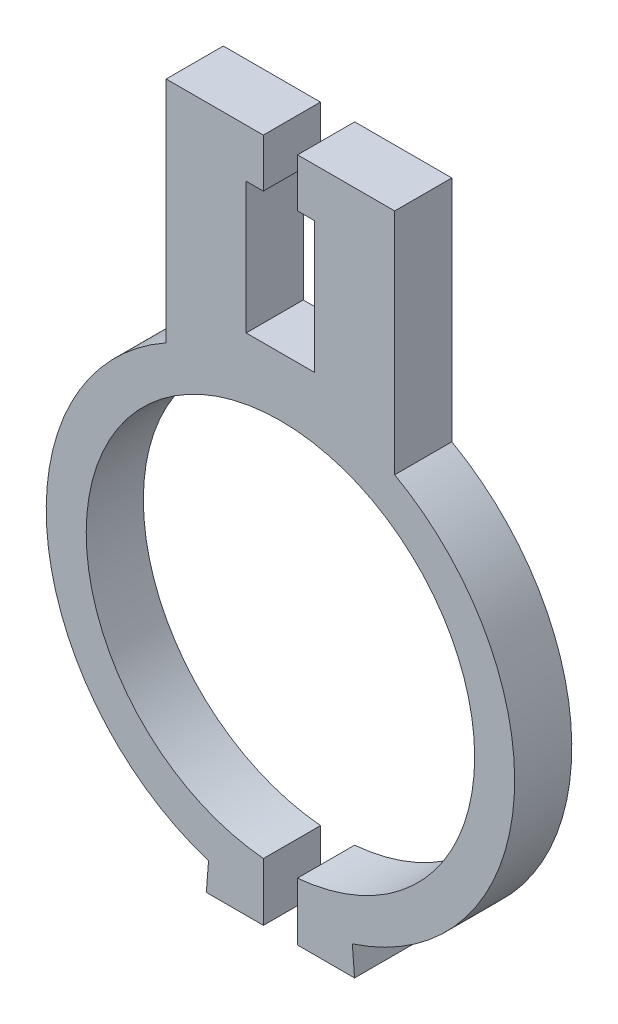
ISO-10303-21;
HEADER;
FILE_DESCRIPTION(('STEP AP214'),'2;1');
FILE_NAME('part.step','',(''),(''),'','','');
FILE_SCHEMA(('AUTOMOTIVE_DESIGN { 1 0 10303 214 1 1 1 1 }'));
ENDSEC;
DATA;
#1=APPLICATION_CONTEXT('core data for automotive mechanical design processes');
#2=APPLICATION_PROTOCOL_DEFINITION('international standard','automotive_design',2000,#1);
#3=PRODUCT_CONTEXT('',#1,'mechanical');
#4=PRODUCT('Part','Part','',(#3));
#5=PRODUCT_RELATED_PRODUCT_CATEGORY('part','',(#4));
#6=PRODUCT_DEFINITION_FORMATION('','',#4);
#7=PRODUCT_DEFINITION_CONTEXT('part definition',#1,'design');
#8=PRODUCT_DEFINITION('design','',#6,#7);
#9=PRODUCT_DEFINITION_SHAPE('','',#8);
#10=(LENGTH_UNIT() NAMED_UNIT(*) SI_UNIT(.MILLI.,.METRE.));
#11=(NAMED_UNIT(*) PLANE_ANGLE_UNIT() SI_UNIT($,.RADIAN.));
#12=(NAMED_UNIT(*) SI_UNIT($,.STERADIAN.) SOLID_ANGLE_UNIT());
#13=UNCERTAINTY_MEASURE_WITH_UNIT(LENGTH_MEASURE(1.E-05),#10,'distance_accuracy_value','');
#14=(GEOMETRIC_REPRESENTATION_CONTEXT(3) GLOBAL_UNCERTAINTY_ASSIGNED_CONTEXT((#13)) GLOBAL_UNIT_ASSIGNED_CONTEXT((#10,
#11,#12)) REPRESENTATION_CONTEXT('',''));
#15=CARTESIAN_POINT('',(0.,0.,0.));
#16=DIRECTION('',(0.,0.,1.));
#17=DIRECTION('',(1.,0.,0.));
#18=AXIS2_PLACEMENT_3D('',#15,#16,#17);
#19=CARTESIAN_POINT('',(0.,0.,10.));
#20=DIRECTION('',(0.,0.,-1.));
#21=DIRECTION('',(-1.,0.,0.));
#22=AXIS2_PLACEMENT_3D('',#19,#20,#21);
#23=CYLINDRICAL_SURFACE('',#22,41.);
#24=CARTESIAN_POINT('',(0.,0.,0.));
#25=DIRECTION('',(0.,0.,1.));
#26=DIRECTION('',(1.,0.,0.));
#27=AXIS2_PLACEMENT_3D('',#24,#25,#26);
#28=CIRCLE('',#27,41.);
#29=CARTESIAN_POINT('',(-20.,35.7910603363466,0.));
#30=VERTEX_POINT('',#29);
#31=CARTESIAN_POINT('',(-12.5812848529524,-39.0219332100406,0.));
#32=VERTEX_POINT('',#31);
#33=EDGE_CURVE('E212',#30,#32,#28,.T.);
#34=ORIENTED_EDGE('',*,*,#33,.T.);
#35=DIRECTION('',(0.,0.,-1.));
#36=VECTOR('',#35,1.);
#37=CARTESIAN_POINT('',(-12.5812848529524,-39.0219332100406,10.));
#38=LINE('',#37,#36);
#39=CARTESIAN_POINT('',(-12.5812848529524,-39.0219332100406,10.));
#40=VERTEX_POINT('',#39);
#41=EDGE_CURVE('E11',#40,#32,#38,.T.);
#42=ORIENTED_EDGE('',*,*,#41,.F.);
#43=CARTESIAN_POINT('',(0.,0.,10.));
#44=DIRECTION('',(0.,0.,1.));
#45=DIRECTION('',(1.,0.,0.));
#46=AXIS2_PLACEMENT_3D('',#43,#44,#45);
#47=CIRCLE('',#46,41.);
#48=CARTESIAN_POINT('',(-20.,35.7910603363466,10.));
#49=VERTEX_POINT('',#48);
#50=EDGE_CURVE('E273',#49,#40,#47,.T.);
#51=ORIENTED_EDGE('',*,*,#50,.F.);
#52=DIRECTION('',(0.,0.,-1.));
#53=VECTOR('',#52,1.);
#54=CARTESIAN_POINT('',(-20.,35.7910603363466,10.));
#55=LINE('',#54,#53);
#56=EDGE_CURVE('E208',#49,#30,#55,.T.);
#57=ORIENTED_EDGE('',*,*,#56,.T.);
#58=EDGE_LOOP('',(#34,#42,#51,#57));
#59=FACE_BOUND('',#58,.T.);
#60=ADVANCED_FACE('F39',(#59),#23,.T.);
#61=CARTESIAN_POINT('',(-12.5812848529524,-39.0219332100406,10.));
#62=DIRECTION('',(0.9968944455987,-0.0787493767242696,0.));
#63=DIRECTION('',(0.0787493767242696,0.9968944455987,0.));
#64=AXIS2_PLACEMENT_3D('',#61,#62,#63);
#65=PLANE('',#64);
#66=DIRECTION('',(-0.0787493767242696,-0.9968944455987,0.));
#67=VECTOR('',#66,1.);
#68=CARTESIAN_POINT('',(-12.5812848529524,-39.0219332100406,0.));
#69=LINE('',#68,#67);
#70=CARTESIAN_POINT('',(-12.9750317365737,-44.0064054380341,0.));
#71=VERTEX_POINT('',#70);
#72=EDGE_CURVE('E216',#32,#71,#69,.T.);
#73=ORIENTED_EDGE('',*,*,#72,.T.);
#74=DIRECTION('',(0.,0.,-1.));
#75=VECTOR('',#74,1.);
#76=CARTESIAN_POINT('',(-12.9750317365737,-44.0064054380341,10.));
#77=LINE('',#76,#75);
#78=CARTESIAN_POINT('',(-12.9750317365737,-44.0064054380341,10.));
#79=VERTEX_POINT('',#78);
#80=EDGE_CURVE('E48',#79,#71,#77,.T.);
#81=ORIENTED_EDGE('',*,*,#80,.F.);
#82=DIRECTION('',(-0.0787493767242696,-0.9968944455987,0.));
#83=VECTOR('',#82,1.);
#84=CARTESIAN_POINT('',(-12.5812848529524,-39.0219332100406,10.));
#85=LINE('',#84,#83);
#86=EDGE_CURVE('E135',#40,#79,#85,.T.);
#87=ORIENTED_EDGE('',*,*,#86,.F.);
#88=ORIENTED_EDGE('',*,*,#41,.T.);
#89=EDGE_LOOP('',(#73,#81,#87,#88));
#90=FACE_BOUND('',#89,.T.);
#91=ADVANCED_FACE('F421',(#90),#65,.F.);
#92=CARTESIAN_POINT('',(-12.9750317365737,-44.0064054380341,10.));
#93=DIRECTION('',(0.,1.,0.));
#94=DIRECTION('',(0.,0.,1.));
#95=AXIS2_PLACEMENT_3D('',#92,#93,#94);
#96=PLANE('',#95);
#97=DIRECTION('',(1.,0.,0.));
#98=VECTOR('',#97,1.);
#99=CARTESIAN_POINT('',(-12.9750317365737,-44.0064054380341,0.));
#100=LINE('',#99,#98);
#101=CARTESIAN_POINT('',(-2.97503173657374,-44.0064054380341,0.));
#102=VERTEX_POINT('',#101);
#103=EDGE_CURVE('E219',#71,#102,#100,.T.);
#104=ORIENTED_EDGE('',*,*,#103,.T.);
#105=DIRECTION('',(0.,0.,-1.));
#106=VECTOR('',#105,1.);
#107=CARTESIAN_POINT('',(-2.97503173657374,-44.0064054380341,10.));
#108=LINE('',#107,#106);
#109=CARTESIAN_POINT('',(-2.97503173657374,-44.0064054380341,10.));
#110=VERTEX_POINT('',#109);
#111=EDGE_CURVE('E332',#110,#102,#108,.T.);
#112=ORIENTED_EDGE('',*,*,#111,.F.);
#113=DIRECTION('',(1.,0.,0.));
#114=VECTOR('',#113,1.);
#115=CARTESIAN_POINT('',(-12.9750317365737,-44.0064054380341,10.));
#116=LINE('',#115,#114);
#117=EDGE_CURVE('E342',#79,#110,#116,.T.);
#118=ORIENTED_EDGE('',*,*,#117,.F.);
#119=ORIENTED_EDGE('',*,*,#80,.T.);
#120=EDGE_LOOP('',(#104,#112,#118,#119));
#121=FACE_BOUND('',#120,.T.);
#122=ADVANCED_FACE('F340',(#121),#96,.F.);
#123=CARTESIAN_POINT('',(-2.97503173657374,-40.8919207933105,10.));
#124=DIRECTION('',(-1.,0.,0.));
#125=DIRECTION('',(0.,0.,1.));
#126=AXIS2_PLACEMENT_3D('',#123,#124,#125);
#127=PLANE('',#126);
#128=DIRECTION('',(0.,1.,0.));
#129=VECTOR('',#128,1.);
#130=CARTESIAN_POINT('',(-2.97503173657374,-40.8919207933105,0.));
#131=LINE('',#130,#129);
#132=CARTESIAN_POINT('',(-2.97503173657374,-33.8695908768674,0.));
#133=VERTEX_POINT('',#132);
#134=EDGE_CURVE('E223',#102,#133,#131,.T.);
#135=ORIENTED_EDGE('',*,*,#134,.T.);
#136=DIRECTION('',(0.,0.,-1.));
#137=VECTOR('',#136,1.);
#138=CARTESIAN_POINT('',(-2.97503173657374,-33.8695908768674,10.));
#139=LINE('',#138,#137);
#140=CARTESIAN_POINT('',(-2.97503173657374,-33.8695908768674,10.));
#141=VERTEX_POINT('',#140);
#142=EDGE_CURVE('E328',#141,#133,#139,.T.);
#143=ORIENTED_EDGE('',*,*,#142,.F.);
#144=DIRECTION('',(0.,1.,0.));
#145=VECTOR('',#144,1.);
#146=CARTESIAN_POINT('',(-2.97503173657374,-44.0064054380341,10.));
#147=LINE('',#146,#145);
#148=EDGE_CURVE('E359',#110,#141,#147,.T.);
#149=ORIENTED_EDGE('',*,*,#148,.F.);
#150=ORIENTED_EDGE('',*,*,#111,.T.);
#151=EDGE_LOOP('',(#135,#143,#149,#150));
#152=FACE_BOUND('',#151,.T.);
#153=ADVANCED_FACE('F349',(#152),#127,.F.);
#154=CARTESIAN_POINT('',(0.,0.,10.));
#155=DIRECTION('',(0.,0.,-1.));
#156=DIRECTION('',(-1.,0.,0.));
#157=AXIS2_PLACEMENT_3D('',#154,#155,#156);
#158=CYLINDRICAL_SURFACE('',#157,34.);
#159=CARTESIAN_POINT('',(0.,0.,0.));
#160=DIRECTION('',(0.,0.,-1.));
#161=DIRECTION('',(1.,0.,0.));
#162=AXIS2_PLACEMENT_3D('',#159,#160,#161);
#163=CIRCLE('',#162,34.);
#164=CARTESIAN_POINT('',(2.97503173657371,-33.8695908768674,0.));
#165=VERTEX_POINT('',#164);
#166=EDGE_CURVE('E226',#133,#165,#163,.T.);
#167=ORIENTED_EDGE('',*,*,#166,.T.);
#168=DIRECTION('',(0.,0.,-1.));
#169=VECTOR('',#168,1.);
#170=CARTESIAN_POINT('',(2.97503173657371,-33.8695908768674,10.));
#171=LINE('',#170,#169);
#172=CARTESIAN_POINT('',(2.97503173657371,-33.8695908768674,10.));
#173=VERTEX_POINT('',#172);
#174=EDGE_CURVE('E324',#173,#165,#171,.T.);
#175=ORIENTED_EDGE('',*,*,#174,.F.);
#176=CARTESIAN_POINT('',(0.,0.,10.));
#177=DIRECTION('',(0.,0.,-1.));
#178=DIRECTION('',(1.,0.,0.));
#179=AXIS2_PLACEMENT_3D('',#176,#177,#178);
#180=CIRCLE('',#179,34.);
#181=EDGE_CURVE('E355',#141,#173,#180,.T.);
#182=ORIENTED_EDGE('',*,*,#181,.F.);
#183=ORIENTED_EDGE('',*,*,#142,.T.);
#184=EDGE_LOOP('',(#167,#175,#182,#183));
#185=FACE_BOUND('',#184,.T.);
#186=ADVANCED_FACE('F353',(#185),#158,.F.);
#187=CARTESIAN_POINT('',(2.97503173657374,-44.0064054380341,10.));
#188=DIRECTION('',(1.,0.,0.));
#189=DIRECTION('',(0.,0.,-1.));
#190=AXIS2_PLACEMENT_3D('',#187,#188,#189);
#191=PLANE('',#190);
#192=DIRECTION('',(0.,-1.,0.));
#193=VECTOR('',#192,1.);
#194=CARTESIAN_POINT('',(2.97503173657374,-44.0064054380341,0.));
#195=LINE('',#194,#193);
#196=CARTESIAN_POINT('',(2.97503173657374,-44.0064054380341,0.));
#197=VERTEX_POINT('',#196);
#198=EDGE_CURVE('E230',#165,#197,#195,.T.);
#199=ORIENTED_EDGE('',*,*,#198,.T.);
#200=DIRECTION('',(0.,0.,-1.));
#201=VECTOR('',#200,1.);
#202=CARTESIAN_POINT('',(2.97503173657374,-44.0064054380341,10.));
#203=LINE('',#202,#201);
#204=CARTESIAN_POINT('',(2.97503173657374,-44.0064054380341,10.));
#205=VERTEX_POINT('',#204);
#206=EDGE_CURVE('E320',#205,#197,#203,.T.);
#207=ORIENTED_EDGE('',*,*,#206,.F.);
#208=DIRECTION('',(0.,-1.,0.));
#209=VECTOR('',#208,1.);
#210=CARTESIAN_POINT('',(2.97503173657374,-40.8919207933105,10.));
#211=LINE('',#210,#209);
#212=EDGE_CURVE('E358',#173,#205,#211,.T.);
#213=ORIENTED_EDGE('',*,*,#212,.F.);
#214=ORIENTED_EDGE('',*,*,#174,.T.);
#215=EDGE_LOOP('',(#199,#207,#213,#214));
#216=FACE_BOUND('',#215,.T.);
#217=ADVANCED_FACE('F434',(#216),#191,.F.);
#218=CARTESIAN_POINT('',(12.9750317365737,-44.0064054380341,10.));
#219=DIRECTION('',(0.,1.,0.));
#220=DIRECTION('',(0.,0.,1.));
#221=AXIS2_PLACEMENT_3D('',#218,#219,#220);
#222=PLANE('',#221);
#223=DIRECTION('',(1.,0.,0.));
#224=VECTOR('',#223,1.);
#225=CARTESIAN_POINT('',(12.9750317365737,-44.0064054380341,0.));
#226=LINE('',#225,#224);
#227=CARTESIAN_POINT('',(12.9750317365737,-44.0064054380341,0.));
#228=VERTEX_POINT('',#227);
#229=EDGE_CURVE('E233',#197,#228,#226,.T.);
#230=ORIENTED_EDGE('',*,*,#229,.T.);
#231=DIRECTION('',(0.,0.,-1.));
#232=VECTOR('',#231,1.);
#233=CARTESIAN_POINT('',(12.9750317365737,-44.0064054380341,10.));
#234=LINE('',#233,#232);
#235=CARTESIAN_POINT('',(12.9750317365737,-44.0064054380341,10.));
#236=VERTEX_POINT('',#235);
#237=EDGE_CURVE('E316',#236,#228,#234,.T.);
#238=ORIENTED_EDGE('',*,*,#237,.F.);
#239=DIRECTION('',(1.,0.,0.));
#240=VECTOR('',#239,1.);
#241=CARTESIAN_POINT('',(12.9750317365737,-44.0064054380341,10.));
#242=LINE('',#241,#240);
#243=EDGE_CURVE('E363',#205,#236,#242,.T.);
#244=ORIENTED_EDGE('',*,*,#243,.F.);
#245=ORIENTED_EDGE('',*,*,#206,.T.);
#246=EDGE_LOOP('',(#230,#238,#244,#245));
#247=FACE_BOUND('',#246,.T.);
#248=ADVANCED_FACE('F437',(#247),#222,.F.);
#249=CARTESIAN_POINT('',(12.5812848529524,-39.0219332100406,10.));
#250=DIRECTION('',(-0.9968944455987,-0.0787493767242696,0.));
#251=DIRECTION('',(0.0787493767242696,-0.9968944455987,0.));
#252=AXIS2_PLACEMENT_3D('',#249,#250,#251);
#253=PLANE('',#252);
#254=DIRECTION('',(-0.0787493767242696,0.9968944455987,0.));
#255=VECTOR('',#254,1.);
#256=CARTESIAN_POINT('',(12.5812848529524,-39.0219332100406,0.));
#257=LINE('',#256,#255);
#258=CARTESIAN_POINT('',(12.5812848529524,-39.0219332100406,0.));
#259=VERTEX_POINT('',#258);
#260=EDGE_CURVE('E236',#228,#259,#257,.T.);
#261=ORIENTED_EDGE('',*,*,#260,.T.);
#262=DIRECTION('',(0.,0.,-1.));
#263=VECTOR('',#262,1.);
#264=CARTESIAN_POINT('',(12.5812848529524,-39.0219332100406,10.));
#265=LINE('',#264,#263);
#266=CARTESIAN_POINT('',(12.5812848529524,-39.0219332100406,10.));
#267=VERTEX_POINT('',#266);
#268=EDGE_CURVE('E312',#267,#259,#265,.T.);
#269=ORIENTED_EDGE('',*,*,#268,.F.);
#270=DIRECTION('',(-0.0787493767242696,0.9968944455987,0.));
#271=VECTOR('',#270,1.);
#272=CARTESIAN_POINT('',(12.5812848529524,-39.0219332100406,10.));
#273=LINE('',#272,#271);
#274=EDGE_CURVE('E370',#236,#267,#273,.T.);
#275=ORIENTED_EDGE('',*,*,#274,.F.);
#276=ORIENTED_EDGE('',*,*,#237,.T.);
#277=EDGE_LOOP('',(#261,#269,#275,#276));
#278=FACE_BOUND('',#277,.T.);
#279=ADVANCED_FACE('F441',(#278),#253,.F.);
#280=CARTESIAN_POINT('',(0.,0.,10.));
#281=DIRECTION('',(0.,0.,-1.));
#282=DIRECTION('',(-1.,0.,0.));
#283=AXIS2_PLACEMENT_3D('',#280,#281,#282);
#284=CYLINDRICAL_SURFACE('',#283,41.);
#285=CARTESIAN_POINT('',(0.,0.,0.));
#286=DIRECTION('',(0.,0.,1.));
#287=DIRECTION('',(1.,0.,0.));
#288=AXIS2_PLACEMENT_3D('',#285,#286,#287);
#289=CIRCLE('',#288,41.);
#290=CARTESIAN_POINT('',(20.,35.7910603363466,0.));
#291=VERTEX_POINT('',#290);
#292=EDGE_CURVE('E239',#259,#291,#289,.T.);
#293=ORIENTED_EDGE('',*,*,#292,.T.);
#294=DIRECTION('',(0.,0.,-1.));
#295=VECTOR('',#294,1.);
#296=CARTESIAN_POINT('',(20.,35.7910603363466,10.));
#297=LINE('',#296,#295);
#298=CARTESIAN_POINT('',(20.,35.7910603363466,10.));
#299=VERTEX_POINT('',#298);
#300=EDGE_CURVE('E308',#299,#291,#297,.T.);
#301=ORIENTED_EDGE('',*,*,#300,.F.);
#302=CARTESIAN_POINT('',(0.,0.,10.));
#303=DIRECTION('',(0.,0.,1.));
#304=DIRECTION('',(1.,0.,0.));
#305=AXIS2_PLACEMENT_3D('',#302,#303,#304);
#306=CIRCLE('',#305,41.);
#307=EDGE_CURVE('E373',#267,#299,#306,.T.);
#308=ORIENTED_EDGE('',*,*,#307,.F.);
#309=ORIENTED_EDGE('',*,*,#268,.T.);
#310=EDGE_LOOP('',(#293,#301,#308,#309));
#311=FACE_BOUND('',#310,.T.);
#312=ADVANCED_FACE('F445',(#311),#284,.T.);
#313=CARTESIAN_POINT('',(20.,35.7910603363466,10.));
#314=DIRECTION('',(-1.,0.,0.));
#315=DIRECTION('',(0.,0.,1.));
#316=AXIS2_PLACEMENT_3D('',#313,#314,#315);
#317=PLANE('',#316);
#318=DIRECTION('',(0.,1.,0.));
#319=VECTOR('',#318,1.);
#320=CARTESIAN_POINT('',(20.,35.7910603363466,0.));
#321=LINE('',#320,#319);
#322=CARTESIAN_POINT('',(20.,75.7910603363466,0.));
#323=VERTEX_POINT('',#322);
#324=EDGE_CURVE('E242',#291,#323,#321,.T.);
#325=ORIENTED_EDGE('',*,*,#324,.T.);
#326=DIRECTION('',(0.,0.,-1.));
#327=VECTOR('',#326,1.);
#328=CARTESIAN_POINT('',(20.,75.7910603363466,10.));
#329=LINE('',#328,#327);
#330=CARTESIAN_POINT('',(20.,75.7910603363466,10.));
#331=VERTEX_POINT('',#330);
#332=EDGE_CURVE('E304',#331,#323,#329,.T.);
#333=ORIENTED_EDGE('',*,*,#332,.F.);
#334=DIRECTION('',(0.,1.,0.));
#335=VECTOR('',#334,1.);
#336=CARTESIAN_POINT('',(20.,35.7910603363466,10.));
#337=LINE('',#336,#335);
#338=EDGE_CURVE('E376',#299,#331,#337,.T.);
#339=ORIENTED_EDGE('',*,*,#338,.F.);
#340=ORIENTED_EDGE('',*,*,#300,.T.);
#341=EDGE_LOOP('',(#325,#333,#339,#340));
#342=FACE_BOUND('',#341,.T.);
#343=ADVANCED_FACE('F449',(#342),#317,.F.);
#344=CARTESIAN_POINT('',(20.,75.7910603363466,10.));
#345=DIRECTION('',(0.,-1.,0.));
#346=DIRECTION('',(0.,0.,-1.));
#347=AXIS2_PLACEMENT_3D('',#344,#345,#346);
#348=PLANE('',#347);
#349=DIRECTION('',(-1.,0.,0.));
#350=VECTOR('',#349,1.);
#351=CARTESIAN_POINT('',(20.,75.7910603363466,0.));
#352=LINE('',#351,#350);
#353=CARTESIAN_POINT('',(3.,75.7910603363466,0.));
#354=VERTEX_POINT('',#353);
#355=EDGE_CURVE('E245',#323,#354,#352,.T.);
#356=ORIENTED_EDGE('',*,*,#355,.T.);
#357=DIRECTION('',(0.,0.,-1.));
#358=VECTOR('',#357,1.);
#359=CARTESIAN_POINT('',(3.,75.7910603363466,10.));
#360=LINE('',#359,#358);
#361=CARTESIAN_POINT('',(3.,75.7910603363466,10.));
#362=VERTEX_POINT('',#361);
#363=EDGE_CURVE('E300',#362,#354,#360,.T.);
#364=ORIENTED_EDGE('',*,*,#363,.F.);
#365=DIRECTION('',(-1.,0.,0.));
#366=VECTOR('',#365,1.);
#367=CARTESIAN_POINT('',(20.,75.7910603363466,10.));
#368=LINE('',#367,#366);
#369=EDGE_CURVE('E379',#331,#362,#368,.T.);
#370=ORIENTED_EDGE('',*,*,#369,.F.);
#371=ORIENTED_EDGE('',*,*,#332,.T.);
#372=EDGE_LOOP('',(#356,#364,#370,#371));
#373=FACE_BOUND('',#372,.T.);
#374=ADVANCED_FACE('F453',(#373),#348,.F.);
#375=CARTESIAN_POINT('',(3.,75.7910603363466,10.));
#376=DIRECTION('',(1.,0.,0.));
#377=DIRECTION('',(0.,1.,0.));
#378=AXIS2_PLACEMENT_3D('',#375,#376,#377);
#379=PLANE('',#378);
#380=DIRECTION('',(0.,-1.,0.));
#381=VECTOR('',#380,1.);
#382=CARTESIAN_POINT('',(3.,75.7910603363466,0.));
#383=LINE('',#382,#381);
#384=CARTESIAN_POINT('',(3.,67.2910603363466,0.));
#385=VERTEX_POINT('',#384);
#386=EDGE_CURVE('E248',#354,#385,#383,.T.);
#387=ORIENTED_EDGE('',*,*,#386,.T.);
#388=DIRECTION('',(0.,0.,-1.));
#389=VECTOR('',#388,1.);
#390=CARTESIAN_POINT('',(3.,67.2910603363466,10.));
#391=LINE('',#390,#389);
#392=CARTESIAN_POINT('',(3.,67.2910603363466,10.));
#393=VERTEX_POINT('',#392);
#394=EDGE_CURVE('E296',#393,#385,#391,.T.);
#395=ORIENTED_EDGE('',*,*,#394,.F.);
#396=DIRECTION('',(0.,-1.,0.));
#397=VECTOR('',#396,1.);
#398=CARTESIAN_POINT('',(3.,75.7910603363466,10.));
#399=LINE('',#398,#397);
#400=EDGE_CURVE('E382',#362,#393,#399,.T.);
#401=ORIENTED_EDGE('',*,*,#400,.F.);
#402=ORIENTED_EDGE('',*,*,#363,.T.);
#403=EDGE_LOOP('',(#387,#395,#401,#402));
#404=FACE_BOUND('',#403,.T.);
#405=ADVANCED_FACE('F457',(#404),#379,.F.);
#406=CARTESIAN_POINT('',(3.,67.2910603363466,10.));
#407=DIRECTION('',(0.,1.,0.));
#408=DIRECTION('',(0.,0.,1.));
#409=AXIS2_PLACEMENT_3D('',#406,#407,#408);
#410=PLANE('',#409);
#411=DIRECTION('',(1.,0.,0.));
#412=VECTOR('',#411,1.);
#413=CARTESIAN_POINT('',(3.,67.2910603363466,0.));
#414=LINE('',#413,#412);
#415=CARTESIAN_POINT('',(6.,67.2910603363466,0.));
#416=VERTEX_POINT('',#415);
#417=EDGE_CURVE('E251',#385,#416,#414,.T.);
#418=ORIENTED_EDGE('',*,*,#417,.T.);
#419=DIRECTION('',(0.,0.,-1.));
#420=VECTOR('',#419,1.);
#421=CARTESIAN_POINT('',(6.,67.2910603363466,10.));
#422=LINE('',#421,#420);
#423=CARTESIAN_POINT('',(6.,67.2910603363466,10.));
#424=VERTEX_POINT('',#423);
#425=EDGE_CURVE('E292',#424,#416,#422,.T.);
#426=ORIENTED_EDGE('',*,*,#425,.F.);
#427=DIRECTION('',(1.,0.,0.));
#428=VECTOR('',#427,1.);
#429=CARTESIAN_POINT('',(3.,67.2910603363466,10.));
#430=LINE('',#429,#428);
#431=EDGE_CURVE('E385',#393,#424,#430,.T.);
#432=ORIENTED_EDGE('',*,*,#431,.F.);
#433=ORIENTED_EDGE('',*,*,#394,.T.);
#434=EDGE_LOOP('',(#418,#426,#432,#433));
#435=FACE_BOUND('',#434,.T.);
#436=ADVANCED_FACE('F461',(#435),#410,.F.);
#437=CARTESIAN_POINT('',(6.,67.2910603363466,10.));
#438=DIRECTION('',(1.,0.,0.));
#439=DIRECTION('',(0.,0.,-1.));
#440=AXIS2_PLACEMENT_3D('',#437,#438,#439);
#441=PLANE('',#440);
#442=DIRECTION('',(0.,-1.,0.));
#443=VECTOR('',#442,1.);
#444=CARTESIAN_POINT('',(6.,67.2910603363466,0.));
#445=LINE('',#444,#443);
#446=CARTESIAN_POINT('',(6.,44.2910603363466,0.));
#447=VERTEX_POINT('',#446);
#448=EDGE_CURVE('E254',#416,#447,#445,.T.);
#449=ORIENTED_EDGE('',*,*,#448,.T.);
#450=DIRECTION('',(0.,0.,-1.));
#451=VECTOR('',#450,1.);
#452=CARTESIAN_POINT('',(6.,44.2910603363466,10.));
#453=LINE('',#452,#451);
#454=CARTESIAN_POINT('',(6.,44.2910603363466,10.));
#455=VERTEX_POINT('',#454);
#456=EDGE_CURVE('E288',#455,#447,#453,.T.);
#457=ORIENTED_EDGE('',*,*,#456,.F.);
#458=DIRECTION('',(0.,-1.,0.));
#459=VECTOR('',#458,1.);
#460=CARTESIAN_POINT('',(6.,67.2910603363466,10.));
#461=LINE('',#460,#459);
#462=EDGE_CURVE('E388',#424,#455,#461,.T.);
#463=ORIENTED_EDGE('',*,*,#462,.F.);
#464=ORIENTED_EDGE('',*,*,#425,.T.);
#465=EDGE_LOOP('',(#449,#457,#463,#464));
#466=FACE_BOUND('',#465,.T.);
#467=ADVANCED_FACE('F465',(#466),#441,.F.);
#468=CARTESIAN_POINT('',(-6.,44.2910603363466,10.));
#469=DIRECTION('',(0.,-1.,0.));
#470=DIRECTION('',(0.,0.,-1.));
#471=AXIS2_PLACEMENT_3D('',#468,#469,#470);
#472=PLANE('',#471);
#473=DIRECTION('',(-1.,0.,0.));
#474=VECTOR('',#473,1.);
#475=CARTESIAN_POINT('',(-6.,44.2910603363466,0.));
#476=LINE('',#475,#474);
#477=CARTESIAN_POINT('',(-6.,44.2910603363466,0.));
#478=VERTEX_POINT('',#477);
#479=EDGE_CURVE('E258',#447,#478,#476,.T.);
#480=ORIENTED_EDGE('',*,*,#479,.T.);
#481=DIRECTION('',(0.,0.,-1.));
#482=VECTOR('',#481,1.);
#483=CARTESIAN_POINT('',(-6.,44.2910603363466,10.));
#484=LINE('',#483,#482);
#485=CARTESIAN_POINT('',(-6.,44.2910603363466,10.));
#486=VERTEX_POINT('',#485);
#487=EDGE_CURVE('E284',#486,#478,#484,.T.);
#488=ORIENTED_EDGE('',*,*,#487,.F.);
#489=DIRECTION('',(-1.,0.,0.));
#490=VECTOR('',#489,1.);
#491=CARTESIAN_POINT('',(6.,44.2910603363466,10.));
#492=LINE('',#491,#490);
#493=EDGE_CURVE('E391',#455,#486,#492,.T.);
#494=ORIENTED_EDGE('',*,*,#493,.F.);
#495=ORIENTED_EDGE('',*,*,#456,.T.);
#496=EDGE_LOOP('',(#480,#488,#494,#495));
#497=FACE_BOUND('',#496,.T.);
#498=ADVANCED_FACE('F469',(#497),#472,.F.);
#499=CARTESIAN_POINT('',(-6.,67.2910603363466,10.));
#500=DIRECTION('',(-1.,0.,0.));
#501=DIRECTION('',(0.,0.,1.));
#502=AXIS2_PLACEMENT_3D('',#499,#500,#501);
#503=PLANE('',#502);
#504=DIRECTION('',(0.,1.,0.));
#505=VECTOR('',#504,1.);
#506=CARTESIAN_POINT('',(-6.,67.2910603363466,0.));
#507=LINE('',#506,#505);
#508=CARTESIAN_POINT('',(-6.,67.2910603363466,0.));
#509=VERTEX_POINT('',#508);
#510=EDGE_CURVE('E261',#478,#509,#507,.T.);
#511=ORIENTED_EDGE('',*,*,#510,.T.);
#512=DIRECTION('',(0.,0.,-1.));
#513=VECTOR('',#512,1.);
#514=CARTESIAN_POINT('',(-6.,67.2910603363466,10.));
#515=LINE('',#514,#513);
#516=CARTESIAN_POINT('',(-6.,67.2910603363466,10.));
#517=VERTEX_POINT('',#516);
#518=EDGE_CURVE('E280',#517,#509,#515,.T.);
#519=ORIENTED_EDGE('',*,*,#518,.F.);
#520=DIRECTION('',(0.,1.,0.));
#521=VECTOR('',#520,1.);
#522=CARTESIAN_POINT('',(-6.,67.2910603363466,10.));
#523=LINE('',#522,#521);
#524=EDGE_CURVE('E394',#486,#517,#523,.T.);
#525=ORIENTED_EDGE('',*,*,#524,.F.);
#526=ORIENTED_EDGE('',*,*,#487,.T.);
#527=EDGE_LOOP('',(#511,#519,#525,#526));
#528=FACE_BOUND('',#527,.T.);
#529=ADVANCED_FACE('F402',(#528),#503,.F.);
#530=CARTESIAN_POINT('',(-3.,67.2910603363466,10.));
#531=DIRECTION('',(0.,1.,0.));
#532=DIRECTION('',(0.,0.,1.));
#533=AXIS2_PLACEMENT_3D('',#530,#531,#532);
#534=PLANE('',#533);
#535=DIRECTION('',(1.,0.,0.));
#536=VECTOR('',#535,1.);
#537=CARTESIAN_POINT('',(-3.,67.2910603363466,0.));
#538=LINE('',#537,#536);
#539=CARTESIAN_POINT('',(-3.,67.2910603363466,0.));
#540=VERTEX_POINT('',#539);
#541=EDGE_CURVE('E264',#509,#540,#538,.T.);
#542=ORIENTED_EDGE('',*,*,#541,.T.);
#543=DIRECTION('',(0.,0.,-1.));
#544=VECTOR('',#543,1.);
#545=CARTESIAN_POINT('',(-3.,67.2910603363466,10.));
#546=LINE('',#545,#544);
#547=CARTESIAN_POINT('',(-3.,67.2910603363466,10.));
#548=VERTEX_POINT('',#547);
#549=EDGE_CURVE('E201',#548,#540,#546,.T.);
#550=ORIENTED_EDGE('',*,*,#549,.F.);
#551=DIRECTION('',(1.,0.,0.));
#552=VECTOR('',#551,1.);
#553=CARTESIAN_POINT('',(-3.,67.2910603363466,10.));
#554=LINE('',#553,#552);
#555=EDGE_CURVE('E190',#517,#548,#554,.T.);
#556=ORIENTED_EDGE('',*,*,#555,.F.);
#557=ORIENTED_EDGE('',*,*,#518,.T.);
#558=EDGE_LOOP('',(#542,#550,#556,#557));
#559=FACE_BOUND('',#558,.T.);
#560=ADVANCED_FACE('F406',(#559),#534,.F.);
#561=CARTESIAN_POINT('',(-3.,75.7910603363466,10.));
#562=DIRECTION('',(-1.,0.,0.));
#563=DIRECTION('',(0.,-1.,0.));
#564=AXIS2_PLACEMENT_3D('',#561,#562,#563);
#565=PLANE('',#564);
#566=DIRECTION('',(0.,1.,0.));
#567=VECTOR('',#566,1.);
#568=CARTESIAN_POINT('',(-3.,75.7910603363466,0.));
#569=LINE('',#568,#567);
#570=CARTESIAN_POINT('',(-3.,75.7910603363466,0.));
#571=VERTEX_POINT('',#570);
#572=EDGE_CURVE('E199',#540,#571,#569,.T.);
#573=ORIENTED_EDGE('',*,*,#572,.T.);
#574=DIRECTION('',(0.,0.,-1.));
#575=VECTOR('',#574,1.);
#576=CARTESIAN_POINT('',(-3.,75.7910603363466,10.));
#577=LINE('',#576,#575);
#578=CARTESIAN_POINT('',(-3.,75.7910603363466,10.));
#579=VERTEX_POINT('',#578);
#580=EDGE_CURVE('E196',#579,#571,#577,.T.);
#581=ORIENTED_EDGE('',*,*,#580,.F.);
#582=DIRECTION('',(0.,1.,0.));
#583=VECTOR('',#582,1.);
#584=CARTESIAN_POINT('',(-3.,75.7910603363466,10.));
#585=LINE('',#584,#583);
#586=EDGE_CURVE('E184',#548,#579,#585,.T.);
#587=ORIENTED_EDGE('',*,*,#586,.F.);
#588=ORIENTED_EDGE('',*,*,#549,.T.);
#589=EDGE_LOOP('',(#573,#581,#587,#588));
#590=FACE_BOUND('',#589,.T.);
#591=ADVANCED_FACE('F197',(#590),#565,.F.);
#592=CARTESIAN_POINT('',(-20.,75.7910603363466,10.));
#593=DIRECTION('',(0.,-1.,0.));
#594=DIRECTION('',(0.,0.,-1.));
#595=AXIS2_PLACEMENT_3D('',#592,#593,#594);
#596=PLANE('',#595);
#597=DIRECTION('',(-1.,0.,0.));
#598=VECTOR('',#597,1.);
#599=CARTESIAN_POINT('',(-20.,75.7910603363466,0.));
#600=LINE('',#599,#598);
#601=CARTESIAN_POINT('',(-20.,75.7910603363466,0.));
#602=VERTEX_POINT('',#601);
#603=EDGE_CURVE('E121',#571,#602,#600,.T.);
#604=ORIENTED_EDGE('',*,*,#603,.T.);
#605=DIRECTION('',(0.,0.,-1.));
#606=VECTOR('',#605,1.);
#607=CARTESIAN_POINT('',(-20.,75.7910603363466,10.));
#608=LINE('',#607,#606);
#609=CARTESIAN_POINT('',(-20.,75.7910603363466,10.));
#610=VERTEX_POINT('',#609);
#611=EDGE_CURVE('E202',#610,#602,#608,.T.);
#612=ORIENTED_EDGE('',*,*,#611,.F.);
#613=DIRECTION('',(-1.,0.,0.));
#614=VECTOR('',#613,1.);
#615=CARTESIAN_POINT('',(-20.,75.7910603363466,10.));
#616=LINE('',#615,#614);
#617=EDGE_CURVE('E188',#579,#610,#616,.T.);
#618=ORIENTED_EDGE('',*,*,#617,.F.);
#619=ORIENTED_EDGE('',*,*,#580,.T.);
#620=EDGE_LOOP('',(#604,#612,#618,#619));
#621=FACE_BOUND('',#620,.T.);
#622=ADVANCED_FACE('F204',(#621),#596,.F.);
#623=CARTESIAN_POINT('',(-20.,35.7910603363466,10.));
#624=DIRECTION('',(1.,0.,0.));
#625=DIRECTION('',(0.,0.,-1.));
#626=AXIS2_PLACEMENT_3D('',#623,#624,#625);
#627=PLANE('',#626);
#628=DIRECTION('',(0.,-1.,0.));
#629=VECTOR('',#628,1.);
#630=CARTESIAN_POINT('',(-20.,35.7910603363466,0.));
#631=LINE('',#630,#629);
#632=EDGE_CURVE('E127',#602,#30,#631,.T.);
#633=ORIENTED_EDGE('',*,*,#632,.T.);
#634=ORIENTED_EDGE('',*,*,#56,.F.);
#635=DIRECTION('',(0.,-1.,0.));
#636=VECTOR('',#635,1.);
#637=CARTESIAN_POINT('',(-20.,35.7910603363466,10.));
#638=LINE('',#637,#636);
#639=EDGE_CURVE('E56',#610,#49,#638,.T.);
#640=ORIENTED_EDGE('',*,*,#639,.F.);
#641=ORIENTED_EDGE('',*,*,#611,.T.);
#642=EDGE_LOOP('',(#633,#634,#640,#641));
#643=FACE_BOUND('',#642,.T.);
#644=ADVANCED_FACE('F410',(#643),#627,.F.);
#645=CARTESIAN_POINT('',(0.,0.,10.));
#646=DIRECTION('',(0.,0.,1.));
#647=DIRECTION('',(1.,0.,0.));
#648=AXIS2_PLACEMENT_3D('',#645,#646,#647);
#649=PLANE('',#648);
#650=ORIENTED_EDGE('',*,*,#50,.T.);
#651=ORIENTED_EDGE('',*,*,#86,.T.);
#652=ORIENTED_EDGE('',*,*,#117,.T.);
#653=ORIENTED_EDGE('',*,*,#148,.T.);
#654=ORIENTED_EDGE('',*,*,#181,.T.);
#655=ORIENTED_EDGE('',*,*,#212,.T.);
#656=ORIENTED_EDGE('',*,*,#243,.T.);
#657=ORIENTED_EDGE('',*,*,#274,.T.);
#658=ORIENTED_EDGE('',*,*,#307,.T.);
#659=ORIENTED_EDGE('',*,*,#338,.T.);
#660=ORIENTED_EDGE('',*,*,#369,.T.);
#661=ORIENTED_EDGE('',*,*,#400,.T.);
#662=ORIENTED_EDGE('',*,*,#431,.T.);
#663=ORIENTED_EDGE('',*,*,#462,.T.);
#664=ORIENTED_EDGE('',*,*,#493,.T.);
#665=ORIENTED_EDGE('',*,*,#524,.T.);
#666=ORIENTED_EDGE('',*,*,#555,.T.);
#667=ORIENTED_EDGE('',*,*,#586,.T.);
#668=ORIENTED_EDGE('',*,*,#617,.T.);
#669=ORIENTED_EDGE('',*,*,#639,.T.);
#670=EDGE_LOOP('',(#650,#651,#652,#653,#654,#655,#656,#657,#658,#659,#660,#661,#662,#663,#664,
#665,#666,#667,#668,#669));
#671=FACE_BOUND('',#670,.T.);
#672=ADVANCED_FACE('F186',(#671),#649,.T.);
#673=CARTESIAN_POINT('',(0.,0.,0.));
#674=DIRECTION('',(0.,0.,1.));
#675=DIRECTION('',(1.,0.,0.));
#676=AXIS2_PLACEMENT_3D('',#673,#674,#675);
#677=PLANE('',#676);
#678=ORIENTED_EDGE('',*,*,#33,.F.);
#679=ORIENTED_EDGE('',*,*,#632,.F.);
#680=ORIENTED_EDGE('',*,*,#603,.F.);
#681=ORIENTED_EDGE('',*,*,#572,.F.);
#682=ORIENTED_EDGE('',*,*,#541,.F.);
#683=ORIENTED_EDGE('',*,*,#510,.F.);
#684=ORIENTED_EDGE('',*,*,#479,.F.);
#685=ORIENTED_EDGE('',*,*,#448,.F.);
#686=ORIENTED_EDGE('',*,*,#417,.F.);
#687=ORIENTED_EDGE('',*,*,#386,.F.);
#688=ORIENTED_EDGE('',*,*,#355,.F.);
#689=ORIENTED_EDGE('',*,*,#324,.F.);
#690=ORIENTED_EDGE('',*,*,#292,.F.);
#691=ORIENTED_EDGE('',*,*,#260,.F.);
#692=ORIENTED_EDGE('',*,*,#229,.F.);
#693=ORIENTED_EDGE('',*,*,#198,.F.);
#694=ORIENTED_EDGE('',*,*,#166,.F.);
#695=ORIENTED_EDGE('',*,*,#134,.F.);
#696=ORIENTED_EDGE('',*,*,#103,.F.);
#697=ORIENTED_EDGE('',*,*,#72,.F.);
#698=EDGE_LOOP('',(#678,#679,#680,#681,#682,#683,#684,#685,#686,#687,#688,#689,#690,#691,#692,
#693,#694,#695,#696,#697));
#699=FACE_BOUND('',#698,.T.);
#700=ADVANCED_FACE('F345',(#699),#677,.F.);
#701=CLOSED_SHELL('',(#60,#91,#122,#153,#186,#217,#248,#279,#312,#343,#374,#405,#436,#467,#498,
#529,#560,#591,#622,#644,#672,#700));
#702=MANIFOLD_SOLID_BREP('B2',#701);
#703=ADVANCED_BREP_SHAPE_REPRESENTATION('',(#18,#702),#14);
#704=SHAPE_DEFINITION_REPRESENTATION(#9,#703);
ENDSEC;
END-ISO-10303-21;
